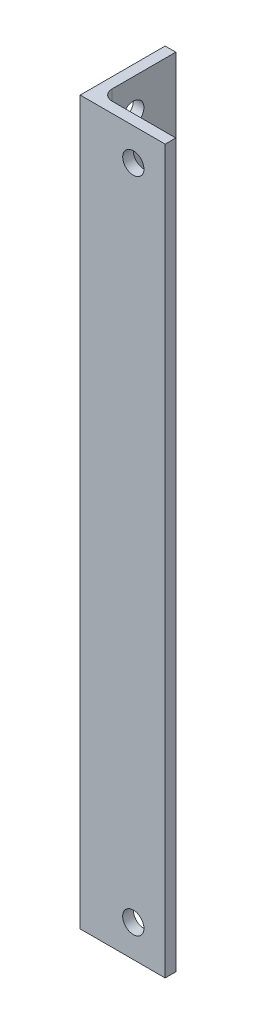
ISO-10303-21;
HEADER;
FILE_DESCRIPTION(('STEP AP214'),'2;1');
FILE_NAME('part.step','',(''),(''),'','','');
FILE_SCHEMA(('AUTOMOTIVE_DESIGN { 1 0 10303 214 1 1 1 1 }'));
ENDSEC;
DATA;
#1=APPLICATION_CONTEXT('core data for automotive mechanical design processes');
#2=APPLICATION_PROTOCOL_DEFINITION('international standard','automotive_design',2000,#1);
#3=PRODUCT_CONTEXT('',#1,'mechanical');
#4=PRODUCT('Part','Part','',(#3));
#5=PRODUCT_RELATED_PRODUCT_CATEGORY('part','',(#4));
#6=PRODUCT_DEFINITION_FORMATION('','',#4);
#7=PRODUCT_DEFINITION_CONTEXT('part definition',#1,'design');
#8=PRODUCT_DEFINITION('design','',#6,#7);
#9=PRODUCT_DEFINITION_SHAPE('','',#8);
#10=(LENGTH_UNIT() NAMED_UNIT(*) SI_UNIT(.MILLI.,.METRE.));
#11=(NAMED_UNIT(*) PLANE_ANGLE_UNIT() SI_UNIT($,.RADIAN.));
#12=(NAMED_UNIT(*) SI_UNIT($,.STERADIAN.) SOLID_ANGLE_UNIT());
#13=UNCERTAINTY_MEASURE_WITH_UNIT(LENGTH_MEASURE(1.E-05),#10,'distance_accuracy_value','');
#14=(GEOMETRIC_REPRESENTATION_CONTEXT(3) GLOBAL_UNCERTAINTY_ASSIGNED_CONTEXT((#13)) GLOBAL_UNIT_ASSIGNED_CONTEXT((#10,
#11,#12)) REPRESENTATION_CONTEXT('',''));
#15=CARTESIAN_POINT('',(0.,0.,0.));
#16=DIRECTION('',(0.,0.,1.));
#17=DIRECTION('',(1.,0.,0.));
#18=AXIS2_PLACEMENT_3D('',#15,#16,#17);
#19=CARTESIAN_POINT('',(3.175,215.9,0.));
#20=DIRECTION('',(0.,0.,1.));
#21=DIRECTION('',(1.,0.,0.));
#22=AXIS2_PLACEMENT_3D('',#19,#20,#21);
#23=PLANE('',#22);
#24=DIRECTION('',(-1.,0.,0.));
#25=VECTOR('',#24,1.);
#26=CARTESIAN_POINT('',(3.175,0.,0.));
#27=LINE('',#26,#25);
#28=CARTESIAN_POINT('',(3.175,0.,0.));
#29=VERTEX_POINT('',#28);
#30=CARTESIAN_POINT('',(0.,0.,0.));
#31=VERTEX_POINT('',#30);
#32=EDGE_CURVE('E121',#29,#31,#27,.T.);
#33=ORIENTED_EDGE('',*,*,#32,.T.);
#34=DIRECTION('',(0.,-1.,0.));
#35=VECTOR('',#34,1.);
#36=CARTESIAN_POINT('',(0.,215.9,0.));
#37=LINE('',#36,#35);
#38=CARTESIAN_POINT('',(0.,215.9,0.));
#39=VERTEX_POINT('',#38);
#40=EDGE_CURVE('E102',#39,#31,#37,.T.);
#41=ORIENTED_EDGE('',*,*,#40,.F.);
#42=DIRECTION('',(-1.,0.,0.));
#43=VECTOR('',#42,1.);
#44=CARTESIAN_POINT('',(3.175,215.9,0.));
#45=LINE('',#44,#43);
#46=CARTESIAN_POINT('',(3.175,215.9,0.));
#47=VERTEX_POINT('',#46);
#48=EDGE_CURVE('E109',#47,#39,#45,.T.);
#49=ORIENTED_EDGE('',*,*,#48,.F.);
#50=DIRECTION('',(0.,-1.,0.));
#51=VECTOR('',#50,1.);
#52=CARTESIAN_POINT('',(3.175,215.9,0.));
#53=LINE('',#52,#51);
#54=EDGE_CURVE('E135',#47,#29,#53,.T.);
#55=ORIENTED_EDGE('',*,*,#54,.T.);
#56=EDGE_LOOP('',(#33,#41,#49,#55));
#57=FACE_BOUND('',#56,.T.);
#58=ADVANCED_FACE('F39',(#57),#23,.F.);
#59=CARTESIAN_POINT('',(0.,215.9,0.));
#60=DIRECTION('',(1.,0.,0.));
#61=DIRECTION('',(0.,0.,-1.));
#62=AXIS2_PLACEMENT_3D('',#59,#60,#61);
#63=PLANE('',#62);
#64=CARTESIAN_POINT('',(0.,9.52500000000001,12.7));
#65=DIRECTION('',(1.,0.,0.));
#66=DIRECTION('',(0.,0.,-1.));
#67=AXIS2_PLACEMENT_3D('',#64,#65,#66);
#68=CIRCLE('',#67,3.175);
#69=CARTESIAN_POINT('',(0.,9.52500000000001,9.525));
#70=VERTEX_POINT('',#69);
#71=EDGE_CURVE('E169',#70,#70,#68,.T.);
#72=ORIENTED_EDGE('',*,*,#71,.T.);
#73=EDGE_LOOP('',(#72));
#74=FACE_BOUND('',#73,.T.);
#75=CARTESIAN_POINT('',(0.,206.375,12.7));
#76=DIRECTION('',(1.,0.,0.));
#77=DIRECTION('',(0.,0.,-1.));
#78=AXIS2_PLACEMENT_3D('',#75,#76,#77);
#79=CIRCLE('',#78,3.175);
#80=CARTESIAN_POINT('',(0.,206.375,9.525));
#81=VERTEX_POINT('',#80);
#82=EDGE_CURVE('E163',#81,#81,#79,.T.);
#83=ORIENTED_EDGE('',*,*,#82,.T.);
#84=EDGE_LOOP('',(#83));
#85=FACE_BOUND('',#84,.T.);
#86=DIRECTION('',(0.,0.,1.));
#87=VECTOR('',#86,1.);
#88=CARTESIAN_POINT('',(0.,0.,0.));
#89=LINE('',#88,#87);
#90=CARTESIAN_POINT('',(0.,0.,25.4));
#91=VERTEX_POINT('',#90);
#92=EDGE_CURVE('E144',#31,#91,#89,.T.);
#93=ORIENTED_EDGE('',*,*,#92,.T.);
#94=DIRECTION('',(0.,-1.,0.));
#95=VECTOR('',#94,1.);
#96=CARTESIAN_POINT('',(0.,215.9,25.4));
#97=LINE('',#96,#95);
#98=CARTESIAN_POINT('',(0.,215.9,25.4));
#99=VERTEX_POINT('',#98);
#100=EDGE_CURVE('E105',#99,#91,#97,.T.);
#101=ORIENTED_EDGE('',*,*,#100,.F.);
#102=DIRECTION('',(0.,0.,1.));
#103=VECTOR('',#102,1.);
#104=CARTESIAN_POINT('',(0.,215.9,0.));
#105=LINE('',#104,#103);
#106=EDGE_CURVE('E98',#39,#99,#105,.T.);
#107=ORIENTED_EDGE('',*,*,#106,.F.);
#108=ORIENTED_EDGE('',*,*,#40,.T.);
#109=EDGE_LOOP('',(#93,#101,#107,#108));
#110=FACE_BOUND('',#109,.T.);
#111=ADVANCED_FACE('F100',(#74,#85,#110),#63,.F.);
#112=CARTESIAN_POINT('',(0.,215.9,25.4));
#113=DIRECTION('',(0.,0.,-1.));
#114=DIRECTION('',(-1.,0.,0.));
#115=AXIS2_PLACEMENT_3D('',#112,#113,#114);
#116=PLANE('',#115);
#117=CARTESIAN_POINT('',(15.875,9.65199999999999,25.4));
#118=DIRECTION('',(0.,0.,-1.));
#119=DIRECTION('',(-1.,0.,0.));
#120=AXIS2_PLACEMENT_3D('',#117,#118,#119);
#121=CIRCLE('',#120,3.175);
#122=CARTESIAN_POINT('',(12.7,9.65199999999999,25.4));
#123=VERTEX_POINT('',#122);
#124=EDGE_CURVE('E157',#123,#123,#121,.T.);
#125=ORIENTED_EDGE('',*,*,#124,.T.);
#126=EDGE_LOOP('',(#125));
#127=FACE_BOUND('',#126,.T.);
#128=CARTESIAN_POINT('',(15.875,206.248,25.4));
#129=DIRECTION('',(0.,0.,-1.));
#130=DIRECTION('',(-1.,0.,0.));
#131=AXIS2_PLACEMENT_3D('',#128,#129,#130);
#132=CIRCLE('',#131,3.175);
#133=CARTESIAN_POINT('',(12.7,206.248,25.4));
#134=VERTEX_POINT('',#133);
#135=EDGE_CURVE('E147',#134,#134,#132,.T.);
#136=ORIENTED_EDGE('',*,*,#135,.T.);
#137=EDGE_LOOP('',(#136));
#138=FACE_BOUND('',#137,.T.);
#139=DIRECTION('',(1.,0.,0.));
#140=VECTOR('',#139,1.);
#141=CARTESIAN_POINT('',(0.,0.,25.4));
#142=LINE('',#141,#140);
#143=CARTESIAN_POINT('',(25.4,0.,25.4));
#144=VERTEX_POINT('',#143);
#145=EDGE_CURVE('E142',#91,#144,#142,.T.);
#146=ORIENTED_EDGE('',*,*,#145,.T.);
#147=DIRECTION('',(0.,-1.,0.));
#148=VECTOR('',#147,1.);
#149=CARTESIAN_POINT('',(25.4,215.9,25.4));
#150=LINE('',#149,#148);
#151=CARTESIAN_POINT('',(25.4,215.9,25.4));
#152=VERTEX_POINT('',#151);
#153=EDGE_CURVE('E126',#152,#144,#150,.T.);
#154=ORIENTED_EDGE('',*,*,#153,.F.);
#155=DIRECTION('',(1.,0.,0.));
#156=VECTOR('',#155,1.);
#157=CARTESIAN_POINT('',(0.,215.9,25.4));
#158=LINE('',#157,#156);
#159=EDGE_CURVE('E108',#99,#152,#158,.T.);
#160=ORIENTED_EDGE('',*,*,#159,.F.);
#161=ORIENTED_EDGE('',*,*,#100,.T.);
#162=EDGE_LOOP('',(#146,#154,#160,#161));
#163=FACE_BOUND('',#162,.T.);
#164=ADVANCED_FACE('F206',(#127,#138,#163),#116,.F.);
#165=CARTESIAN_POINT('',(25.4,215.9,25.4));
#166=DIRECTION('',(-1.,0.,0.));
#167=DIRECTION('',(0.,0.,1.));
#168=AXIS2_PLACEMENT_3D('',#165,#166,#167);
#169=PLANE('',#168);
#170=DIRECTION('',(0.,0.,-1.));
#171=VECTOR('',#170,1.);
#172=CARTESIAN_POINT('',(25.4,0.,25.4));
#173=LINE('',#172,#171);
#174=CARTESIAN_POINT('',(25.4,0.,22.225));
#175=VERTEX_POINT('',#174);
#176=EDGE_CURVE('E140',#144,#175,#173,.T.);
#177=ORIENTED_EDGE('',*,*,#176,.T.);
#178=DIRECTION('',(0.,-1.,0.));
#179=VECTOR('',#178,1.);
#180=CARTESIAN_POINT('',(25.4,215.9,22.225));
#181=LINE('',#180,#179);
#182=CARTESIAN_POINT('',(25.4,215.9,22.225));
#183=VERTEX_POINT('',#182);
#184=EDGE_CURVE('E132',#183,#175,#181,.T.);
#185=ORIENTED_EDGE('',*,*,#184,.F.);
#186=DIRECTION('',(0.,0.,-1.));
#187=VECTOR('',#186,1.);
#188=CARTESIAN_POINT('',(25.4,215.9,25.4));
#189=LINE('',#188,#187);
#190=EDGE_CURVE('E151',#152,#183,#189,.T.);
#191=ORIENTED_EDGE('',*,*,#190,.F.);
#192=ORIENTED_EDGE('',*,*,#153,.T.);
#193=EDGE_LOOP('',(#177,#185,#191,#192));
#194=FACE_BOUND('',#193,.T.);
#195=ADVANCED_FACE('F203',(#194),#169,.F.);
#196=CARTESIAN_POINT('',(25.4,215.9,22.225));
#197=DIRECTION('',(0.,0.,1.));
#198=DIRECTION('',(1.,0.,0.));
#199=AXIS2_PLACEMENT_3D('',#196,#197,#198);
#200=PLANE('',#199);
#201=CARTESIAN_POINT('',(15.875,9.65199999999999,22.225));
#202=DIRECTION('',(0.,0.,-1.));
#203=DIRECTION('',(-1.,0.,0.));
#204=AXIS2_PLACEMENT_3D('',#201,#202,#203);
#205=CIRCLE('',#204,3.175);
#206=CARTESIAN_POINT('',(12.7,9.65199999999999,22.225));
#207=VERTEX_POINT('',#206);
#208=EDGE_CURVE('E160',#207,#207,#205,.T.);
#209=ORIENTED_EDGE('',*,*,#208,.F.);
#210=EDGE_LOOP('',(#209));
#211=FACE_BOUND('',#210,.T.);
#212=CARTESIAN_POINT('',(15.875,206.248,22.225));
#213=DIRECTION('',(0.,0.,-1.));
#214=DIRECTION('',(-1.,0.,0.));
#215=AXIS2_PLACEMENT_3D('',#212,#213,#214);
#216=CIRCLE('',#215,3.175);
#217=CARTESIAN_POINT('',(12.7,206.248,22.225));
#218=VERTEX_POINT('',#217);
#219=EDGE_CURVE('E154',#218,#218,#216,.T.);
#220=ORIENTED_EDGE('',*,*,#219,.F.);
#221=EDGE_LOOP('',(#220));
#222=FACE_BOUND('',#221,.T.);
#223=DIRECTION('',(-1.,0.,0.));
#224=VECTOR('',#223,1.);
#225=CARTESIAN_POINT('',(25.4,0.,22.225));
#226=LINE('',#225,#224);
#227=CARTESIAN_POINT('',(6.35,0.,22.225));
#228=VERTEX_POINT('',#227);
#229=EDGE_CURVE('E138',#175,#228,#226,.T.);
#230=ORIENTED_EDGE('',*,*,#229,.T.);
#231=DIRECTION('',(0.,-1.,0.));
#232=VECTOR('',#231,1.);
#233=CARTESIAN_POINT('',(6.35,215.9,22.225));
#234=LINE('',#233,#232);
#235=CARTESIAN_POINT('',(6.35,215.9,22.225));
#236=VERTEX_POINT('',#235);
#237=EDGE_CURVE('E54',#228,#236,#234,.F.);
#238=ORIENTED_EDGE('',*,*,#237,.T.);
#239=DIRECTION('',(-1.,0.,0.));
#240=VECTOR('',#239,1.);
#241=CARTESIAN_POINT('',(25.4,215.9,22.225));
#242=LINE('',#241,#240);
#243=EDGE_CURVE('E149',#183,#236,#242,.T.);
#244=ORIENTED_EDGE('',*,*,#243,.F.);
#245=ORIENTED_EDGE('',*,*,#184,.T.);
#246=EDGE_LOOP('',(#230,#238,#244,#245));
#247=FACE_BOUND('',#246,.T.);
#248=ADVANCED_FACE('F190',(#211,#222,#247),#200,.F.);
#249=CARTESIAN_POINT('',(3.175,215.9,22.225));
#250=DIRECTION('',(-1.,0.,0.));
#251=DIRECTION('',(0.,0.,1.));
#252=AXIS2_PLACEMENT_3D('',#249,#250,#251);
#253=PLANE('',#252);
#254=CARTESIAN_POINT('',(3.175,9.52500000000001,12.7));
#255=DIRECTION('',(1.,0.,0.));
#256=DIRECTION('',(0.,0.,-1.));
#257=AXIS2_PLACEMENT_3D('',#254,#255,#256);
#258=CIRCLE('',#257,3.175);
#259=CARTESIAN_POINT('',(3.175,9.52500000000001,9.525));
#260=VERTEX_POINT('',#259);
#261=EDGE_CURVE('E172',#260,#260,#258,.T.);
#262=ORIENTED_EDGE('',*,*,#261,.F.);
#263=EDGE_LOOP('',(#262));
#264=FACE_BOUND('',#263,.T.);
#265=CARTESIAN_POINT('',(3.175,206.375,12.7));
#266=DIRECTION('',(1.,0.,0.));
#267=DIRECTION('',(0.,0.,-1.));
#268=AXIS2_PLACEMENT_3D('',#265,#266,#267);
#269=CIRCLE('',#268,3.175);
#270=CARTESIAN_POINT('',(3.175,206.375,9.525));
#271=VERTEX_POINT('',#270);
#272=EDGE_CURVE('E166',#271,#271,#269,.T.);
#273=ORIENTED_EDGE('',*,*,#272,.F.);
#274=EDGE_LOOP('',(#273));
#275=FACE_BOUND('',#274,.T.);
#276=DIRECTION('',(0.,0.,-1.));
#277=VECTOR('',#276,1.);
#278=CARTESIAN_POINT('',(3.175,215.9,22.225));
#279=LINE('',#278,#277);
#280=CARTESIAN_POINT('',(3.175,215.9,19.05));
#281=VERTEX_POINT('',#280);
#282=EDGE_CURVE('E114',#281,#47,#279,.T.);
#283=ORIENTED_EDGE('',*,*,#282,.F.);
#284=DIRECTION('',(0.,-1.,0.));
#285=VECTOR('',#284,1.);
#286=CARTESIAN_POINT('',(3.175,0.,19.05));
#287=LINE('',#286,#285);
#288=CARTESIAN_POINT('',(3.175,0.,19.05));
#289=VERTEX_POINT('',#288);
#290=EDGE_CURVE('E122',#281,#289,#287,.T.);
#291=ORIENTED_EDGE('',*,*,#290,.T.);
#292=DIRECTION('',(0.,0.,-1.));
#293=VECTOR('',#292,1.);
#294=CARTESIAN_POINT('',(3.175,0.,22.225));
#295=LINE('',#294,#293);
#296=EDGE_CURVE('E118',#289,#29,#295,.T.);
#297=ORIENTED_EDGE('',*,*,#296,.T.);
#298=ORIENTED_EDGE('',*,*,#54,.F.);
#299=EDGE_LOOP('',(#283,#291,#297,#298));
#300=FACE_BOUND('',#299,.T.);
#301=ADVANCED_FACE('F187',(#264,#275,#300),#253,.F.);
#302=CARTESIAN_POINT('',(0.,215.9,0.));
#303=DIRECTION('',(0.,1.,0.));
#304=DIRECTION('',(0.,0.,1.));
#305=AXIS2_PLACEMENT_3D('',#302,#303,#304);
#306=PLANE('',#305);
#307=ORIENTED_EDGE('',*,*,#48,.T.);
#308=ORIENTED_EDGE('',*,*,#106,.T.);
#309=ORIENTED_EDGE('',*,*,#159,.T.);
#310=ORIENTED_EDGE('',*,*,#190,.T.);
#311=ORIENTED_EDGE('',*,*,#243,.T.);
#312=CARTESIAN_POINT('',(6.35,215.9,19.05));
#313=DIRECTION('',(0.,1.,0.));
#314=DIRECTION('',(0.,0.,1.));
#315=AXIS2_PLACEMENT_3D('',#312,#313,#314);
#316=CIRCLE('',#315,3.175);
#317=EDGE_CURVE('E11',#236,#281,#316,.F.);
#318=ORIENTED_EDGE('',*,*,#317,.T.);
#319=ORIENTED_EDGE('',*,*,#282,.T.);
#320=EDGE_LOOP('',(#307,#308,#309,#310,#311,#318,#319));
#321=FACE_BOUND('',#320,.T.);
#322=ADVANCED_FACE('F112',(#321),#306,.T.);
#323=CARTESIAN_POINT('',(0.,0.,0.));
#324=DIRECTION('',(0.,1.,0.));
#325=DIRECTION('',(0.,0.,1.));
#326=AXIS2_PLACEMENT_3D('',#323,#324,#325);
#327=PLANE('',#326);
#328=ORIENTED_EDGE('',*,*,#32,.F.);
#329=ORIENTED_EDGE('',*,*,#296,.F.);
#330=CARTESIAN_POINT('',(6.35,0.,19.05));
#331=DIRECTION('',(0.,1.,0.));
#332=DIRECTION('',(0.,0.,1.));
#333=AXIS2_PLACEMENT_3D('',#330,#331,#332);
#334=CIRCLE('',#333,3.175);
#335=EDGE_CURVE('E47',#289,#228,#334,.T.);
#336=ORIENTED_EDGE('',*,*,#335,.T.);
#337=ORIENTED_EDGE('',*,*,#229,.F.);
#338=ORIENTED_EDGE('',*,*,#176,.F.);
#339=ORIENTED_EDGE('',*,*,#145,.F.);
#340=ORIENTED_EDGE('',*,*,#92,.F.);
#341=EDGE_LOOP('',(#328,#329,#336,#337,#338,#339,#340));
#342=FACE_BOUND('',#341,.T.);
#343=ADVANCED_FACE('F201',(#342),#327,.F.);
#344=CARTESIAN_POINT('',(6.35,215.9,19.05));
#345=DIRECTION('',(0.,1.,0.));
#346=DIRECTION('',(0.,0.,1.));
#347=AXIS2_PLACEMENT_3D('',#344,#345,#346);
#348=CYLINDRICAL_SURFACE('',#347,3.175);
#349=ORIENTED_EDGE('',*,*,#317,.F.);
#350=ORIENTED_EDGE('',*,*,#237,.F.);
#351=ORIENTED_EDGE('',*,*,#335,.F.);
#352=ORIENTED_EDGE('',*,*,#290,.F.);
#353=EDGE_LOOP('',(#349,#350,#351,#352));
#354=FACE_BOUND('',#353,.T.);
#355=ADVANCED_FACE('F41',(#354),#348,.F.);
#356=CARTESIAN_POINT('',(15.875,206.248,25.4));
#357=DIRECTION('',(0.,0.,-1.));
#358=DIRECTION('',(-1.,0.,0.));
#359=AXIS2_PLACEMENT_3D('',#356,#357,#358);
#360=CYLINDRICAL_SURFACE('',#359,3.175);
#361=ORIENTED_EDGE('',*,*,#135,.F.);
#362=EDGE_LOOP('',(#361));
#363=FACE_BOUND('',#362,.T.);
#364=ORIENTED_EDGE('',*,*,#219,.T.);
#365=EDGE_LOOP('',(#364));
#366=FACE_BOUND('',#365,.T.);
#367=ADVANCED_FACE('F246',(#363,#366),#360,.F.);
#368=CARTESIAN_POINT('',(15.875,9.65199999999999,25.4));
#369=DIRECTION('',(0.,0.,-1.));
#370=DIRECTION('',(-1.,0.,0.));
#371=AXIS2_PLACEMENT_3D('',#368,#369,#370);
#372=CYLINDRICAL_SURFACE('',#371,3.175);
#373=ORIENTED_EDGE('',*,*,#124,.F.);
#374=EDGE_LOOP('',(#373));
#375=FACE_BOUND('',#374,.T.);
#376=ORIENTED_EDGE('',*,*,#208,.T.);
#377=EDGE_LOOP('',(#376));
#378=FACE_BOUND('',#377,.T.);
#379=ADVANCED_FACE('F251',(#375,#378),#372,.F.);
#380=CARTESIAN_POINT('',(0.,206.375,12.7));
#381=DIRECTION('',(1.,0.,0.));
#382=DIRECTION('',(0.,0.,-1.));
#383=AXIS2_PLACEMENT_3D('',#380,#381,#382);
#384=CYLINDRICAL_SURFACE('',#383,3.175);
#385=ORIENTED_EDGE('',*,*,#82,.F.);
#386=EDGE_LOOP('',(#385));
#387=FACE_BOUND('',#386,.T.);
#388=ORIENTED_EDGE('',*,*,#272,.T.);
#389=EDGE_LOOP('',(#388));
#390=FACE_BOUND('',#389,.T.);
#391=ADVANCED_FACE('F183',(#387,#390),#384,.F.);
#392=CARTESIAN_POINT('',(0.,9.52500000000001,12.7));
#393=DIRECTION('',(1.,0.,0.));
#394=DIRECTION('',(0.,0.,-1.));
#395=AXIS2_PLACEMENT_3D('',#392,#393,#394);
#396=CYLINDRICAL_SURFACE('',#395,3.175);
#397=ORIENTED_EDGE('',*,*,#71,.F.);
#398=EDGE_LOOP('',(#397));
#399=FACE_BOUND('',#398,.T.);
#400=ORIENTED_EDGE('',*,*,#261,.T.);
#401=EDGE_LOOP('',(#400));
#402=FACE_BOUND('',#401,.T.);
#403=ADVANCED_FACE('F180',(#399,#402),#396,.F.);
#404=CLOSED_SHELL('',(#58,#111,#164,#195,#248,#301,#322,#343,#355,#367,#379,#391,#403));
#405=MANIFOLD_SOLID_BREP('B2',#404);
#406=ADVANCED_BREP_SHAPE_REPRESENTATION('',(#18,#405),#14);
#407=SHAPE_DEFINITION_REPRESENTATION(#9,#406);
ENDSEC;
END-ISO-10303-21;
